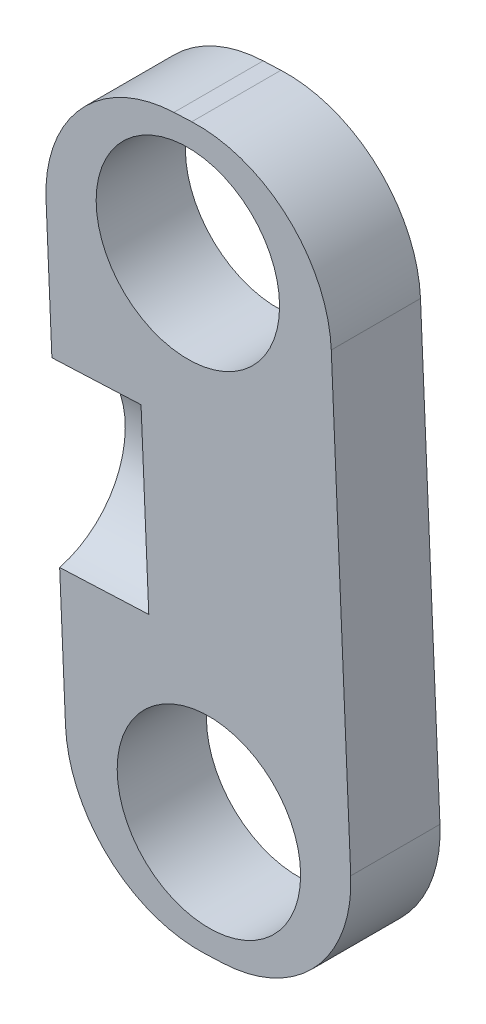
ISO-10303-21;
HEADER;
FILE_DESCRIPTION(('STEP AP214'),'2;1');
FILE_NAME('part.step','',(''),(''),'','','');
FILE_SCHEMA(('AUTOMOTIVE_DESIGN { 1 0 10303 214 1 1 1 1 }'));
ENDSEC;
DATA;
#1=APPLICATION_CONTEXT('core data for automotive mechanical design processes');
#2=APPLICATION_PROTOCOL_DEFINITION('international standard','automotive_design',2000,#1);
#3=PRODUCT_CONTEXT('',#1,'mechanical');
#4=PRODUCT('Part','Part','',(#3));
#5=PRODUCT_RELATED_PRODUCT_CATEGORY('part','',(#4));
#6=PRODUCT_DEFINITION_FORMATION('','',#4);
#7=PRODUCT_DEFINITION_CONTEXT('part definition',#1,'design');
#8=PRODUCT_DEFINITION('design','',#6,#7);
#9=PRODUCT_DEFINITION_SHAPE('','',#8);
#10=(LENGTH_UNIT() NAMED_UNIT(*) SI_UNIT(.MILLI.,.METRE.));
#11=(NAMED_UNIT(*) PLANE_ANGLE_UNIT() SI_UNIT($,.RADIAN.));
#12=(NAMED_UNIT(*) SI_UNIT($,.STERADIAN.) SOLID_ANGLE_UNIT());
#13=UNCERTAINTY_MEASURE_WITH_UNIT(LENGTH_MEASURE(1.E-05),#10,'distance_accuracy_value','');
#14=(GEOMETRIC_REPRESENTATION_CONTEXT(3) GLOBAL_UNCERTAINTY_ASSIGNED_CONTEXT((#13)) GLOBAL_UNIT_ASSIGNED_CONTEXT((#10,
#11,#12)) REPRESENTATION_CONTEXT('',''));
#15=CARTESIAN_POINT('',(0.,0.,0.));
#16=DIRECTION('',(0.,0.,1.));
#17=DIRECTION('',(1.,0.,0.));
#18=AXIS2_PLACEMENT_3D('',#15,#16,#17);
#19=CARTESIAN_POINT('',(0.,0.,3.175));
#20=DIRECTION('',(0.,0.,1.));
#21=DIRECTION('',(1.,0.,0.));
#22=AXIS2_PLACEMENT_3D('',#19,#20,#21);
#23=PLANE('',#22);
#24=DIRECTION('',(-0.999048221581858,-0.0436193873653347,0.));
#25=VECTOR('',#24,1.);
#26=CARTESIAN_POINT('',(194.434181118779,11.6581086453338,3.175));
#27=LINE('',#26,#25);
#28=CARTESIAN_POINT('',(194.434181118779,11.6581086453338,3.175));
#29=VERTEX_POINT('',#28);
#30=CARTESIAN_POINT('',(191.262203015256,11.5196170904488,3.175));
#31=VERTEX_POINT('',#30);
#32=EDGE_CURVE('E55',#29,#31,#27,.T.);
#33=ORIENTED_EDGE('',*,*,#32,.F.);
#34=DIRECTION('',(0.0436193873653347,-0.999048221581858,0.));
#35=VECTOR('',#34,1.);
#36=CARTESIAN_POINT('',(194.572276297567,8.49520904700704,3.175));
#37=LINE('',#36,#35);
#38=CARTESIAN_POINT('',(194.710371476355,5.33230944868028,3.175));
#39=VERTEX_POINT('',#38);
#40=EDGE_CURVE('E11',#29,#39,#37,.T.);
#41=ORIENTED_EDGE('',*,*,#40,.T.);
#42=DIRECTION('',(-0.999048221581858,-0.0436193873653347,0.));
#43=VECTOR('',#42,1.);
#44=CARTESIAN_POINT('',(194.710371476355,5.33230944868028,3.175));
#45=LINE('',#44,#43);
#46=CARTESIAN_POINT('',(191.538393372832,5.19381789379534,3.175));
#47=VERTEX_POINT('',#46);
#48=EDGE_CURVE('E121',#47,#39,#45,.F.);
#49=ORIENTED_EDGE('',*,*,#48,.F.);
#50=DIRECTION('',(0.0436193873653347,-0.999048221581858,0.));
#51=VECTOR('',#50,1.);
#52=CARTESIAN_POINT('',(191.954264413584,-4.33119492196723,3.175));
#53=LINE('',#52,#51);
#54=CARTESIAN_POINT('',(191.746527081257,0.426772233316373,3.175));
#55=VERTEX_POINT('',#54);
#56=EDGE_CURVE('E63',#47,#55,#53,.T.);
#57=ORIENTED_EDGE('',*,*,#56,.T.);
#58=CARTESIAN_POINT('',(196.50449423654,0.634509565643778,3.175));
#59=DIRECTION('',(0.,0.,1.));
#60=DIRECTION('',(1.,0.,0.));
#61=AXIS2_PLACEMENT_3D('',#58,#59,#60);
#62=CIRCLE('',#61,4.7625);
#63=CARTESIAN_POINT('',(196.712231568868,-4.12345758963982,3.175));
#64=VERTEX_POINT('',#63);
#65=EDGE_CURVE('E213',#55,#64,#62,.T.);
#66=ORIENTED_EDGE('',*,*,#65,.T.);
#67=DIRECTION('',(0.999048221581858,0.0436193873653353,0.));
#68=VECTOR('',#67,1.);
#69=CARTESIAN_POINT('',(191.954264413584,-4.33119492196723,3.175));
#70=LINE('',#69,#68);
#71=CARTESIAN_POINT('',(197.346627189572,-4.09575927866283,3.175));
#72=VERTEX_POINT('',#71);
#73=EDGE_CURVE('E163',#64,#72,#70,.T.);
#74=ORIENTED_EDGE('',*,*,#73,.T.);
#75=CARTESIAN_POINT('',(197.138889857245,0.662207876620771,3.175));
#76=DIRECTION('',(0.,0.,1.));
#77=DIRECTION('',(1.,0.,0.));
#78=AXIS2_PLACEMENT_3D('',#75,#76,#77);
#79=CIRCLE('',#78,4.7625);
#80=CARTESIAN_POINT('',(201.896857012528,0.869945208948186,3.175));
#81=VERTEX_POINT('',#80);
#82=EDGE_CURVE('E216',#72,#81,#79,.T.);
#83=ORIENTED_EDGE('',*,*,#82,.T.);
#84=DIRECTION('',(-0.0436193873653369,0.999048221581858,0.));
#85=VECTOR('',#84,1.);
#86=CARTESIAN_POINT('',(200.996661905776,21.4878028818438,3.175));
#87=LINE('',#86,#85);
#88=CARTESIAN_POINT('',(201.204399238104,16.7298357265602,3.175));
#89=VERTEX_POINT('',#88);
#90=EDGE_CURVE('E152',#81,#89,#87,.T.);
#91=ORIENTED_EDGE('',*,*,#90,.T.);
#92=CARTESIAN_POINT('',(196.44643208282,16.5220983942328,3.175));
#93=DIRECTION('',(0.,0.,1.));
#94=DIRECTION('',(1.,0.,0.));
#95=AXIS2_PLACEMENT_3D('',#92,#93,#94);
#96=CIRCLE('',#95,4.7625);
#97=CARTESIAN_POINT('',(196.238694750493,21.2800655495164,3.175));
#98=VERTEX_POINT('',#97);
#99=EDGE_CURVE('E210',#89,#98,#96,.T.);
#100=ORIENTED_EDGE('',*,*,#99,.T.);
#101=DIRECTION('',(-0.999048221581858,-0.0436193873653357,0.));
#102=VECTOR('',#101,1.);
#103=CARTESIAN_POINT('',(200.996661905776,21.4878028818438,3.175));
#104=LINE('',#103,#102);
#105=CARTESIAN_POINT('',(195.604299129788,21.2523672385394,3.175));
#106=VERTEX_POINT('',#105);
#107=EDGE_CURVE('E156',#98,#106,#104,.T.);
#108=ORIENTED_EDGE('',*,*,#107,.T.);
#109=CARTESIAN_POINT('',(195.812036462115,16.4944000832558,3.175));
#110=DIRECTION('',(0.,0.,1.));
#111=DIRECTION('',(1.,0.,0.));
#112=AXIS2_PLACEMENT_3D('',#109,#110,#111);
#113=CIRCLE('',#112,4.7625);
#114=CARTESIAN_POINT('',(191.054069306832,16.2866627509284,3.175));
#115=VERTEX_POINT('',#114);
#116=EDGE_CURVE('E207',#106,#115,#113,.T.);
#117=ORIENTED_EDGE('',*,*,#116,.T.);
#118=EDGE_CURVE('E128',#115,#31,#53,.T.);
#119=ORIENTED_EDGE('',*,*,#118,.T.);
#120=EDGE_LOOP('',(#33,#41,#49,#57,#66,#74,#83,#91,#100,#108,#117,#119));
#121=FACE_BOUND('',#120,.T.);
#122=CARTESIAN_POINT('',(196.85,0.,3.175));
#123=DIRECTION('',(0.,0.,1.));
#124=DIRECTION('',(1.,0.,0.));
#125=AXIS2_PLACEMENT_3D('',#122,#123,#124);
#126=CIRCLE('',#125,3.26390000000001);
#127=CARTESIAN_POINT('',(200.1139,0.,3.175));
#128=VERTEX_POINT('',#127);
#129=EDGE_CURVE('E144',#128,#128,#126,.T.);
#130=ORIENTED_EDGE('',*,*,#129,.F.);
#131=EDGE_LOOP('',(#130));
#132=FACE_BOUND('',#131,.T.);
#133=CARTESIAN_POINT('',(196.10092631936,17.1566079598765,3.175));
#134=DIRECTION('',(0.,0.,1.));
#135=DIRECTION('',(1.,0.,0.));
#136=AXIS2_PLACEMENT_3D('',#133,#134,#135);
#137=CIRCLE('',#136,3.26389999999998);
#138=CARTESIAN_POINT('',(199.36482631936,17.1566079598765,3.175));
#139=VERTEX_POINT('',#138);
#140=EDGE_CURVE('E135',#139,#139,#137,.T.);
#141=ORIENTED_EDGE('',*,*,#140,.F.);
#142=EDGE_LOOP('',(#141));
#143=FACE_BOUND('',#142,.T.);
#144=ADVANCED_FACE('F39',(#121,#132,#143),#23,.T.);
#145=CARTESIAN_POINT('',(0.,0.,0.));
#146=DIRECTION('',(0.,0.,1.));
#147=DIRECTION('',(1.,0.,0.));
#148=AXIS2_PLACEMENT_3D('',#145,#146,#147);
#149=PLANE('',#148);
#150=DIRECTION('',(-0.0436193873653369,0.999048221581858,0.));
#151=VECTOR('',#150,1.);
#152=CARTESIAN_POINT('',(200.996661905776,21.4878028818438,0.));
#153=LINE('',#152,#151);
#154=CARTESIAN_POINT('',(201.896857012528,0.869945208948186,0.));
#155=VERTEX_POINT('',#154);
#156=CARTESIAN_POINT('',(201.204399238104,16.7298357265602,0.));
#157=VERTEX_POINT('',#156);
#158=EDGE_CURVE('E148',#155,#157,#153,.T.);
#159=ORIENTED_EDGE('',*,*,#158,.F.);
#160=CARTESIAN_POINT('',(197.138889857245,0.662207876620771,0.));
#161=DIRECTION('',(0.,0.,1.));
#162=DIRECTION('',(1.,0.,0.));
#163=AXIS2_PLACEMENT_3D('',#160,#161,#162);
#164=CIRCLE('',#163,4.7625);
#165=CARTESIAN_POINT('',(197.346627189572,-4.09575927866283,0.));
#166=VERTEX_POINT('',#165);
#167=EDGE_CURVE('E197',#155,#166,#164,.F.);
#168=ORIENTED_EDGE('',*,*,#167,.T.);
#169=DIRECTION('',(0.999048221581858,0.0436193873653353,0.));
#170=VECTOR('',#169,1.);
#171=CARTESIAN_POINT('',(191.954264413584,-4.33119492196723,0.));
#172=LINE('',#171,#170);
#173=CARTESIAN_POINT('',(196.712231568868,-4.12345758963982,0.));
#174=VERTEX_POINT('',#173);
#175=EDGE_CURVE('E157',#174,#166,#172,.T.);
#176=ORIENTED_EDGE('',*,*,#175,.F.);
#177=CARTESIAN_POINT('',(196.50449423654,0.634509565643778,0.));
#178=DIRECTION('',(0.,0.,1.));
#179=DIRECTION('',(1.,0.,0.));
#180=AXIS2_PLACEMENT_3D('',#177,#178,#179);
#181=CIRCLE('',#180,4.7625);
#182=CARTESIAN_POINT('',(191.746527081257,0.426772233316373,0.));
#183=VERTEX_POINT('',#182);
#184=EDGE_CURVE('E194',#174,#183,#181,.F.);
#185=ORIENTED_EDGE('',*,*,#184,.T.);
#186=DIRECTION('',(0.0436193873653347,-0.999048221581858,0.));
#187=VECTOR('',#186,1.);
#188=CARTESIAN_POINT('',(191.954264413584,-4.33119492196723,0.));
#189=LINE('',#188,#187);
#190=CARTESIAN_POINT('',(191.054069306832,16.2866627509284,0.));
#191=VERTEX_POINT('',#190);
#192=EDGE_CURVE('E175',#191,#183,#189,.T.);
#193=ORIENTED_EDGE('',*,*,#192,.F.);
#194=CARTESIAN_POINT('',(195.812036462115,16.4944000832558,0.));
#195=DIRECTION('',(0.,0.,1.));
#196=DIRECTION('',(1.,0.,0.));
#197=AXIS2_PLACEMENT_3D('',#194,#195,#196);
#198=CIRCLE('',#197,4.7625);
#199=CARTESIAN_POINT('',(195.604299129788,21.2523672385394,0.));
#200=VERTEX_POINT('',#199);
#201=EDGE_CURVE('E188',#191,#200,#198,.F.);
#202=ORIENTED_EDGE('',*,*,#201,.T.);
#203=DIRECTION('',(-0.999048221581858,-0.0436193873653357,0.));
#204=VECTOR('',#203,1.);
#205=CARTESIAN_POINT('',(200.996661905776,21.4878028818438,0.));
#206=LINE('',#205,#204);
#207=CARTESIAN_POINT('',(196.238694750493,21.2800655495164,0.));
#208=VERTEX_POINT('',#207);
#209=EDGE_CURVE('E171',#208,#200,#206,.T.);
#210=ORIENTED_EDGE('',*,*,#209,.F.);
#211=CARTESIAN_POINT('',(196.44643208282,16.5220983942328,0.));
#212=DIRECTION('',(0.,0.,1.));
#213=DIRECTION('',(1.,0.,0.));
#214=AXIS2_PLACEMENT_3D('',#211,#212,#213);
#215=CIRCLE('',#214,4.7625);
#216=EDGE_CURVE('E191',#208,#157,#215,.F.);
#217=ORIENTED_EDGE('',*,*,#216,.T.);
#218=EDGE_LOOP('',(#159,#168,#176,#185,#193,#202,#210,#217));
#219=FACE_BOUND('',#218,.T.);
#220=CARTESIAN_POINT('',(196.85,0.,0.));
#221=DIRECTION('',(0.,0.,1.));
#222=DIRECTION('',(1.,0.,0.));
#223=AXIS2_PLACEMENT_3D('',#220,#221,#222);
#224=CIRCLE('',#223,3.26390000000001);
#225=CARTESIAN_POINT('',(200.1139,0.,0.));
#226=VERTEX_POINT('',#225);
#227=EDGE_CURVE('E142',#226,#226,#224,.T.);
#228=ORIENTED_EDGE('',*,*,#227,.T.);
#229=EDGE_LOOP('',(#228));
#230=FACE_BOUND('',#229,.T.);
#231=CARTESIAN_POINT('',(196.10092631936,17.1566079598765,0.));
#232=DIRECTION('',(0.,0.,1.));
#233=DIRECTION('',(1.,0.,0.));
#234=AXIS2_PLACEMENT_3D('',#231,#232,#233);
#235=CIRCLE('',#234,3.26389999999998);
#236=CARTESIAN_POINT('',(199.36482631936,17.1566079598765,0.));
#237=VERTEX_POINT('',#236);
#238=EDGE_CURVE('E130',#237,#237,#235,.T.);
#239=ORIENTED_EDGE('',*,*,#238,.T.);
#240=EDGE_LOOP('',(#239));
#241=FACE_BOUND('',#240,.T.);
#242=ADVANCED_FACE('F240',(#219,#230,#241),#149,.F.);
#243=CARTESIAN_POINT('',(200.996661905776,21.4878028818438,3.175));
#244=DIRECTION('',(-0.999048221581858,-0.0436193873653369,0.));
#245=DIRECTION('',(0.0436193873653369,-0.999048221581858,0.));
#246=AXIS2_PLACEMENT_3D('',#243,#244,#245);
#247=PLANE('',#246);
#248=ORIENTED_EDGE('',*,*,#90,.F.);
#249=DIRECTION('',(0.,0.,-1.));
#250=VECTOR('',#249,1.);
#251=CARTESIAN_POINT('',(201.896857012528,0.869945208948189,3.175));
#252=LINE('',#251,#250);
#253=EDGE_CURVE('E184',#81,#155,#252,.T.);
#254=ORIENTED_EDGE('',*,*,#253,.T.);
#255=ORIENTED_EDGE('',*,*,#158,.T.);
#256=DIRECTION('',(0.,0.,-1.));
#257=VECTOR('',#256,1.);
#258=CARTESIAN_POINT('',(201.204399238104,16.7298357265602,3.175));
#259=LINE('',#258,#257);
#260=EDGE_CURVE('E167',#157,#89,#259,.F.);
#261=ORIENTED_EDGE('',*,*,#260,.T.);
#262=EDGE_LOOP('',(#248,#254,#255,#261));
#263=FACE_BOUND('',#262,.T.);
#264=ADVANCED_FACE('F266',(#263),#247,.F.);
#265=CARTESIAN_POINT('',(200.996661905776,21.4878028818438,3.175));
#266=DIRECTION('',(0.0436193873653357,-0.999048221581858,0.));
#267=DIRECTION('',(0.999048221581858,0.0436193873653357,0.));
#268=AXIS2_PLACEMENT_3D('',#265,#266,#267);
#269=PLANE('',#268);
#270=ORIENTED_EDGE('',*,*,#107,.F.);
#271=DIRECTION('',(0.,0.,-1.));
#272=VECTOR('',#271,1.);
#273=CARTESIAN_POINT('',(196.238694750493,21.2800655495164,3.175));
#274=LINE('',#273,#272);
#275=EDGE_CURVE('E48',#98,#208,#274,.T.);
#276=ORIENTED_EDGE('',*,*,#275,.T.);
#277=ORIENTED_EDGE('',*,*,#209,.T.);
#278=DIRECTION('',(0.,0.,-1.));
#279=VECTOR('',#278,1.);
#280=CARTESIAN_POINT('',(195.604299129788,21.2523672385394,3.175));
#281=LINE('',#280,#279);
#282=EDGE_CURVE('E226',#200,#106,#281,.F.);
#283=ORIENTED_EDGE('',*,*,#282,.T.);
#284=EDGE_LOOP('',(#270,#276,#277,#283));
#285=FACE_BOUND('',#284,.T.);
#286=ADVANCED_FACE('F234',(#285),#269,.F.);
#287=CARTESIAN_POINT('',(191.954264413584,-4.33119492196723,3.175));
#288=DIRECTION('',(0.999048221581858,0.0436193873653347,0.));
#289=DIRECTION('',(-0.0436193873653347,0.999048221581858,0.));
#290=AXIS2_PLACEMENT_3D('',#287,#288,#289);
#291=PLANE('',#290);
#292=ORIENTED_EDGE('',*,*,#56,.F.);
#293=CARTESIAN_POINT('',(191.400298194044,8.3567174921221,3.96875));
#294=DIRECTION('',(-0.999048221581858,-0.0436193873653347,0.));
#295=DIRECTION('',(0.0436193873653347,-0.999048221581858,0.));
#296=AXIS2_PLACEMENT_3D('',#293,#294,#295);
#297=CIRCLE('',#296,3.2639);
#298=EDGE_CURVE('E123',#31,#47,#297,.T.);
#299=ORIENTED_EDGE('',*,*,#298,.F.);
#300=ORIENTED_EDGE('',*,*,#118,.F.);
#301=DIRECTION('',(0.,0.,-1.));
#302=VECTOR('',#301,1.);
#303=CARTESIAN_POINT('',(191.054069306832,16.2866627509284,3.175));
#304=LINE('',#303,#302);
#305=EDGE_CURVE('E219',#115,#191,#304,.T.);
#306=ORIENTED_EDGE('',*,*,#305,.T.);
#307=ORIENTED_EDGE('',*,*,#192,.T.);
#308=DIRECTION('',(0.,0.,-1.));
#309=VECTOR('',#308,1.);
#310=CARTESIAN_POINT('',(191.746527081257,0.426772233316371,3.175));
#311=LINE('',#310,#309);
#312=EDGE_CURVE('E223',#183,#55,#311,.F.);
#313=ORIENTED_EDGE('',*,*,#312,.T.);
#314=EDGE_LOOP('',(#292,#299,#300,#306,#307,#313));
#315=FACE_BOUND('',#314,.T.);
#316=ADVANCED_FACE('F247',(#315),#291,.F.);
#317=CARTESIAN_POINT('',(191.954264413584,-4.33119492196723,3.175));
#318=DIRECTION('',(-0.0436193873653353,0.999048221581858,0.));
#319=DIRECTION('',(-0.999048221581858,-0.0436193873653353,0.));
#320=AXIS2_PLACEMENT_3D('',#317,#318,#319);
#321=PLANE('',#320);
#322=ORIENTED_EDGE('',*,*,#175,.T.);
#323=DIRECTION('',(0.,0.,-1.));
#324=VECTOR('',#323,1.);
#325=CARTESIAN_POINT('',(197.346627189572,-4.09575927866283,3.175));
#326=LINE('',#325,#324);
#327=EDGE_CURVE('E204',#166,#72,#326,.F.);
#328=ORIENTED_EDGE('',*,*,#327,.T.);
#329=ORIENTED_EDGE('',*,*,#73,.F.);
#330=DIRECTION('',(0.,0.,-1.));
#331=VECTOR('',#330,1.);
#332=CARTESIAN_POINT('',(196.712231568868,-4.12345758963982,3.175));
#333=LINE('',#332,#331);
#334=EDGE_CURVE('E200',#64,#174,#333,.T.);
#335=ORIENTED_EDGE('',*,*,#334,.T.);
#336=EDGE_LOOP('',(#322,#328,#329,#335));
#337=FACE_BOUND('',#336,.T.);
#338=ADVANCED_FACE('F258',(#337),#321,.F.);
#339=CARTESIAN_POINT('',(196.85,0.,3.175));
#340=DIRECTION('',(0.,0.,-1.));
#341=DIRECTION('',(-1.,0.,0.));
#342=AXIS2_PLACEMENT_3D('',#339,#340,#341);
#343=CYLINDRICAL_SURFACE('',#342,3.26390000000001);
#344=ORIENTED_EDGE('',*,*,#129,.T.);
#345=EDGE_LOOP('',(#344));
#346=FACE_BOUND('',#345,.T.);
#347=ORIENTED_EDGE('',*,*,#227,.F.);
#348=EDGE_LOOP('',(#347));
#349=FACE_BOUND('',#348,.T.);
#350=ADVANCED_FACE('F282',(#346,#349),#343,.F.);
#351=CARTESIAN_POINT('',(196.10092631936,17.1566079598765,3.175));
#352=DIRECTION('',(0.,0.,-1.));
#353=DIRECTION('',(-1.,0.,0.));
#354=AXIS2_PLACEMENT_3D('',#351,#352,#353);
#355=CYLINDRICAL_SURFACE('',#354,3.26389999999998);
#356=ORIENTED_EDGE('',*,*,#140,.T.);
#357=EDGE_LOOP('',(#356));
#358=FACE_BOUND('',#357,.T.);
#359=ORIENTED_EDGE('',*,*,#238,.F.);
#360=EDGE_LOOP('',(#359));
#361=FACE_BOUND('',#360,.T.);
#362=ADVANCED_FACE('F294',(#358,#361),#355,.F.);
#363=CARTESIAN_POINT('',(197.138889857245,0.662207876620771,3.175));
#364=DIRECTION('',(0.,0.,-1.));
#365=DIRECTION('',(-1.,0.,0.));
#366=AXIS2_PLACEMENT_3D('',#363,#364,#365);
#367=CYLINDRICAL_SURFACE('',#366,4.7625);
#368=ORIENTED_EDGE('',*,*,#82,.F.);
#369=ORIENTED_EDGE('',*,*,#327,.F.);
#370=ORIENTED_EDGE('',*,*,#167,.F.);
#371=ORIENTED_EDGE('',*,*,#253,.F.);
#372=EDGE_LOOP('',(#368,#369,#370,#371));
#373=FACE_BOUND('',#372,.T.);
#374=ADVANCED_FACE('F262',(#373),#367,.T.);
#375=CARTESIAN_POINT('',(196.50449423654,0.634509565643778,3.175));
#376=DIRECTION('',(0.,0.,-1.));
#377=DIRECTION('',(-1.,0.,0.));
#378=AXIS2_PLACEMENT_3D('',#375,#376,#377);
#379=CYLINDRICAL_SURFACE('',#378,4.7625);
#380=ORIENTED_EDGE('',*,*,#65,.F.);
#381=ORIENTED_EDGE('',*,*,#312,.F.);
#382=ORIENTED_EDGE('',*,*,#184,.F.);
#383=ORIENTED_EDGE('',*,*,#334,.F.);
#384=EDGE_LOOP('',(#380,#381,#382,#383));
#385=FACE_BOUND('',#384,.T.);
#386=ADVANCED_FACE('F254',(#385),#379,.T.);
#387=CARTESIAN_POINT('',(196.44643208282,16.5220983942328,3.175));
#388=DIRECTION('',(0.,0.,-1.));
#389=DIRECTION('',(-1.,0.,0.));
#390=AXIS2_PLACEMENT_3D('',#387,#388,#389);
#391=CYLINDRICAL_SURFACE('',#390,4.7625);
#392=ORIENTED_EDGE('',*,*,#99,.F.);
#393=ORIENTED_EDGE('',*,*,#260,.F.);
#394=ORIENTED_EDGE('',*,*,#216,.F.);
#395=ORIENTED_EDGE('',*,*,#275,.F.);
#396=EDGE_LOOP('',(#392,#393,#394,#395));
#397=FACE_BOUND('',#396,.T.);
#398=ADVANCED_FACE('F268',(#397),#391,.T.);
#399=CARTESIAN_POINT('',(195.812036462115,16.4944000832558,3.175));
#400=DIRECTION('',(0.,0.,-1.));
#401=DIRECTION('',(-1.,0.,0.));
#402=AXIS2_PLACEMENT_3D('',#399,#400,#401);
#403=CYLINDRICAL_SURFACE('',#402,4.7625);
#404=ORIENTED_EDGE('',*,*,#116,.F.);
#405=ORIENTED_EDGE('',*,*,#282,.F.);
#406=ORIENTED_EDGE('',*,*,#201,.F.);
#407=ORIENTED_EDGE('',*,*,#305,.F.);
#408=EDGE_LOOP('',(#404,#405,#406,#407));
#409=FACE_BOUND('',#408,.T.);
#410=ADVANCED_FACE('F41',(#409),#403,.T.);
#411=CARTESIAN_POINT('',(194.572276297567,8.49520904700703,3.96875));
#412=DIRECTION('',(-0.999048221581858,-0.0436193873653347,0.));
#413=DIRECTION('',(0.0436193873653347,-0.999048221581858,0.));
#414=AXIS2_PLACEMENT_3D('',#411,#412,#413);
#415=CYLINDRICAL_SURFACE('',#414,3.2639);
#416=ORIENTED_EDGE('',*,*,#32,.T.);
#417=ORIENTED_EDGE('',*,*,#298,.T.);
#418=ORIENTED_EDGE('',*,*,#48,.T.);
#419=CARTESIAN_POINT('',(194.572276297567,8.49520904700703,3.96875));
#420=DIRECTION('',(-0.999048221581858,-0.0436193873653347,0.));
#421=DIRECTION('',(0.0436193873653347,-0.999048221581858,0.));
#422=AXIS2_PLACEMENT_3D('',#419,#420,#421);
#423=CIRCLE('',#422,3.2639);
#424=EDGE_CURVE('E119',#29,#39,#423,.T.);
#425=ORIENTED_EDGE('',*,*,#424,.F.);
#426=EDGE_LOOP('',(#416,#417,#418,#425));
#427=FACE_BOUND('',#426,.T.);
#428=ADVANCED_FACE('F120',(#427),#415,.F.);
#429=CARTESIAN_POINT('',(194.572276297567,8.49520904700703,3.96875));
#430=DIRECTION('',(-0.999048221581858,-0.0436193873653347,0.));
#431=DIRECTION('',(0.0436193873653347,-0.999048221581858,0.));
#432=AXIS2_PLACEMENT_3D('',#429,#430,#431);
#433=PLANE('',#432);
#434=ORIENTED_EDGE('',*,*,#424,.T.);
#435=ORIENTED_EDGE('',*,*,#40,.F.);
#436=EDGE_LOOP('',(#434,#435));
#437=FACE_BOUND('',#436,.T.);
#438=ADVANCED_FACE('F118',(#437),#433,.T.);
#439=CLOSED_SHELL('',(#144,#242,#264,#286,#316,#338,#350,#362,#374,#386,#398,#410,#428,#438));
#440=MANIFOLD_SOLID_BREP('B2',#439);
#441=ADVANCED_BREP_SHAPE_REPRESENTATION('',(#18,#440),#14);
#442=SHAPE_DEFINITION_REPRESENTATION(#9,#441);
ENDSEC;
END-ISO-10303-21;
